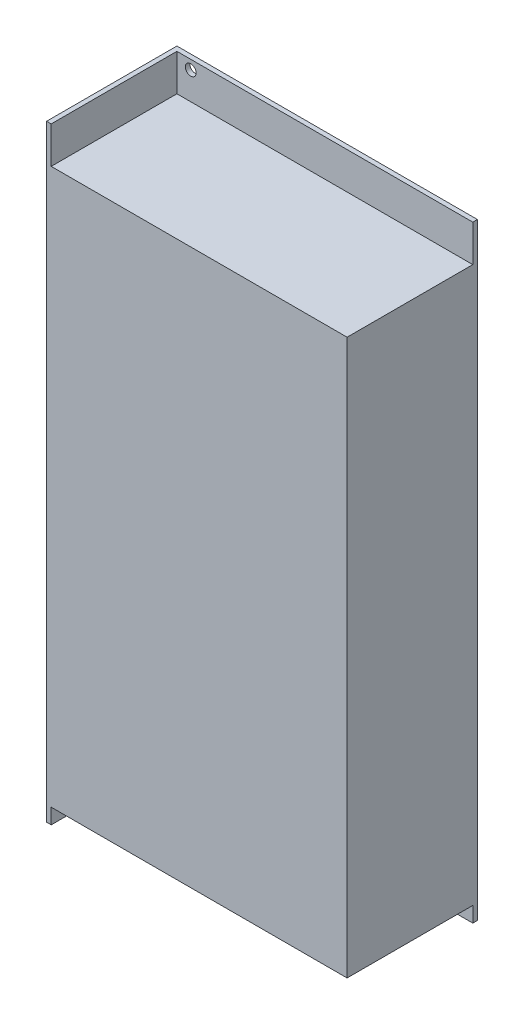
ISO-10303-21;
HEADER;
FILE_DESCRIPTION(('STEP AP214'),'2;1');
FILE_NAME('part.step','',(''),(''),'','','');
FILE_SCHEMA(('AUTOMOTIVE_DESIGN { 1 0 10303 214 1 1 1 1 }'));
ENDSEC;
DATA;
#1=APPLICATION_CONTEXT('core data for automotive mechanical design processes');
#2=APPLICATION_PROTOCOL_DEFINITION('international standard','automotive_design',2000,#1);
#3=PRODUCT_CONTEXT('',#1,'mechanical');
#4=PRODUCT('Part','Part','',(#3));
#5=PRODUCT_RELATED_PRODUCT_CATEGORY('part','',(#4));
#6=PRODUCT_DEFINITION_FORMATION('','',#4);
#7=PRODUCT_DEFINITION_CONTEXT('part definition',#1,'design');
#8=PRODUCT_DEFINITION('design','',#6,#7);
#9=PRODUCT_DEFINITION_SHAPE('','',#8);
#10=(LENGTH_UNIT() NAMED_UNIT(*) SI_UNIT(.MILLI.,.METRE.));
#11=(NAMED_UNIT(*) PLANE_ANGLE_UNIT() SI_UNIT($,.RADIAN.));
#12=(NAMED_UNIT(*) SI_UNIT($,.STERADIAN.) SOLID_ANGLE_UNIT());
#13=UNCERTAINTY_MEASURE_WITH_UNIT(LENGTH_MEASURE(1.E-05),#10,'distance_accuracy_value','');
#14=(GEOMETRIC_REPRESENTATION_CONTEXT(3) GLOBAL_UNCERTAINTY_ASSIGNED_CONTEXT((#13)) GLOBAL_UNIT_ASSIGNED_CONTEXT((#10,
#11,#12)) REPRESENTATION_CONTEXT('',''));
#15=CARTESIAN_POINT('',(0.,0.,0.));
#16=DIRECTION('',(0.,0.,1.));
#17=DIRECTION('',(1.,0.,0.));
#18=AXIS2_PLACEMENT_3D('',#15,#16,#17);
#19=CARTESIAN_POINT('',(0.,0.,1.5));
#20=DIRECTION('',(0.,0.,1.));
#21=DIRECTION('',(1.,0.,0.));
#22=AXIS2_PLACEMENT_3D('',#19,#20,#21);
#23=PLANE('',#22);
#24=CARTESIAN_POINT('',(-92.,-3.00000000000001,1.5));
#25=DIRECTION('',(0.,0.,1.));
#26=DIRECTION('',(1.,0.,0.));
#27=AXIS2_PLACEMENT_3D('',#24,#25,#26);
#28=CIRCLE('',#27,1.75);
#29=CARTESIAN_POINT('',(-90.25,-3.00000000000001,1.5));
#30=VERTEX_POINT('',#29);
#31=EDGE_CURVE('E205',#30,#30,#28,.T.);
#32=ORIENTED_EDGE('',*,*,#31,.F.);
#33=EDGE_LOOP('',(#32));
#34=FACE_BOUND('',#33,.T.);
#35=DIRECTION('',(0.,1.,0.));
#36=VECTOR('',#35,1.);
#37=CARTESIAN_POINT('',(-96.5,0.,1.5));
#38=LINE('',#37,#36);
#39=CARTESIAN_POINT('',(-96.5,-12.,1.5));
#40=VERTEX_POINT('',#39);
#41=CARTESIAN_POINT('',(-96.5,0.,1.5));
#42=VERTEX_POINT('',#41);
#43=EDGE_CURVE('E58',#40,#42,#38,.T.);
#44=ORIENTED_EDGE('',*,*,#43,.F.);
#45=DIRECTION('',(1.,0.,0.));
#46=VECTOR('',#45,1.);
#47=CARTESIAN_POINT('',(0.,-12.,1.5));
#48=LINE('',#47,#46);
#49=CARTESIAN_POINT('',(0.,-12.,1.5));
#50=VERTEX_POINT('',#49);
#51=EDGE_CURVE('E141',#40,#50,#48,.T.);
#52=ORIENTED_EDGE('',*,*,#51,.T.);
#53=DIRECTION('',(0.,-1.,0.));
#54=VECTOR('',#53,1.);
#55=CARTESIAN_POINT('',(0.,0.,1.5));
#56=LINE('',#55,#54);
#57=CARTESIAN_POINT('',(0.,0.,1.5));
#58=VERTEX_POINT('',#57);
#59=EDGE_CURVE('E198',#58,#50,#56,.T.);
#60=ORIENTED_EDGE('',*,*,#59,.F.);
#61=DIRECTION('',(-1.,0.,0.));
#62=VECTOR('',#61,1.);
#63=CARTESIAN_POINT('',(0.,0.,1.5));
#64=LINE('',#63,#62);
#65=EDGE_CURVE('E201',#58,#42,#64,.T.);
#66=ORIENTED_EDGE('',*,*,#65,.T.);
#67=EDGE_LOOP('',(#44,#52,#60,#66));
#68=FACE_BOUND('',#67,.T.);
#69=ADVANCED_FACE('F35',(#34,#68),#23,.T.);
#70=CARTESIAN_POINT('',(-6.74999999999998,-195.25,1.5));
#71=DIRECTION('',(0.,0.,-1.));
#72=DIRECTION('',(-1.,0.,0.));
#73=AXIS2_PLACEMENT_3D('',#70,#71,#72);
#74=CYLINDRICAL_SURFACE('',#73,1.75);
#75=CARTESIAN_POINT('',(-6.74999999999998,-195.25,0.));
#76=DIRECTION('',(0.,0.,1.));
#77=DIRECTION('',(1.,0.,0.));
#78=AXIS2_PLACEMENT_3D('',#75,#76,#77);
#79=CIRCLE('',#78,1.75);
#80=CARTESIAN_POINT('',(-4.99999999999998,-195.25,0.));
#81=VERTEX_POINT('',#80);
#82=CARTESIAN_POINT('',(-8.49999999999998,-195.25,0.));
#83=VERTEX_POINT('',#82);
#84=EDGE_CURVE('E143',#81,#83,#79,.T.);
#85=ORIENTED_EDGE('',*,*,#84,.F.);
#86=DIRECTION('',(0.,0.,-1.));
#87=VECTOR('',#86,1.);
#88=CARTESIAN_POINT('',(-4.99999999999998,-195.25,1.5));
#89=LINE('',#88,#87);
#90=CARTESIAN_POINT('',(-4.99999999999998,-195.25,1.5));
#91=VERTEX_POINT('',#90);
#92=EDGE_CURVE('E11',#91,#81,#89,.T.);
#93=ORIENTED_EDGE('',*,*,#92,.F.);
#94=CARTESIAN_POINT('',(-6.74999999999998,-195.25,1.5));
#95=DIRECTION('',(0.,0.,1.));
#96=DIRECTION('',(1.,0.,0.));
#97=AXIS2_PLACEMENT_3D('',#94,#95,#96);
#98=CIRCLE('',#97,1.75);
#99=CARTESIAN_POINT('',(-8.49999999999998,-195.25,1.5));
#100=VERTEX_POINT('',#99);
#101=EDGE_CURVE('E187',#91,#100,#98,.T.);
#102=ORIENTED_EDGE('',*,*,#101,.T.);
#103=DIRECTION('',(0.,0.,-1.));
#104=VECTOR('',#103,1.);
#105=CARTESIAN_POINT('',(-8.49999999999998,-195.25,1.5));
#106=LINE('',#105,#104);
#107=EDGE_CURVE('E208',#100,#83,#106,.T.);
#108=ORIENTED_EDGE('',*,*,#107,.T.);
#109=EDGE_LOOP('',(#85,#93,#102,#108));
#110=FACE_BOUND('',#109,.T.);
#111=ADVANCED_FACE('F37',(#110),#74,.F.);
#112=CARTESIAN_POINT('',(-4.99999999999998,0.,1.5));
#113=DIRECTION('',(1.,0.,0.));
#114=DIRECTION('',(0.,0.,-1.));
#115=AXIS2_PLACEMENT_3D('',#112,#113,#114);
#116=PLANE('',#115);
#117=DIRECTION('',(0.,-1.,0.));
#118=VECTOR('',#117,1.);
#119=CARTESIAN_POINT('',(-4.99999999999998,0.,0.));
#120=LINE('',#119,#118);
#121=CARTESIAN_POINT('',(-4.99999999999998,-198.,0.));
#122=VERTEX_POINT('',#121);
#123=EDGE_CURVE('E211',#81,#122,#120,.T.);
#124=ORIENTED_EDGE('',*,*,#123,.T.);
#125=DIRECTION('',(0.,0.,-1.));
#126=VECTOR('',#125,1.);
#127=CARTESIAN_POINT('',(-4.99999999999998,-198.,1.5));
#128=LINE('',#127,#126);
#129=CARTESIAN_POINT('',(-4.99999999999998,-198.,1.5));
#130=VERTEX_POINT('',#129);
#131=EDGE_CURVE('E43',#130,#122,#128,.T.);
#132=ORIENTED_EDGE('',*,*,#131,.F.);
#133=DIRECTION('',(0.,-1.,0.));
#134=VECTOR('',#133,1.);
#135=CARTESIAN_POINT('',(-4.99999999999998,0.,1.5));
#136=LINE('',#135,#134);
#137=EDGE_CURVE('E190',#91,#130,#136,.T.);
#138=ORIENTED_EDGE('',*,*,#137,.F.);
#139=ORIENTED_EDGE('',*,*,#92,.T.);
#140=EDGE_LOOP('',(#124,#132,#138,#139));
#141=FACE_BOUND('',#140,.T.);
#142=ADVANCED_FACE('F251',(#141),#116,.F.);
#143=CARTESIAN_POINT('',(0.,-198.,1.5));
#144=DIRECTION('',(0.,-1.,0.));
#145=DIRECTION('',(0.,0.,-1.));
#146=AXIS2_PLACEMENT_3D('',#143,#144,#145);
#147=PLANE('',#146);
#148=DIRECTION('',(-1.,0.,0.));
#149=VECTOR('',#148,1.);
#150=CARTESIAN_POINT('',(0.,-198.,0.));
#151=LINE('',#150,#149);
#152=CARTESIAN_POINT('',(0.,-198.,0.));
#153=VERTEX_POINT('',#152);
#154=EDGE_CURVE('E214',#153,#122,#151,.T.);
#155=ORIENTED_EDGE('',*,*,#154,.F.);
#156=DIRECTION('',(0.,0.,-1.));
#157=VECTOR('',#156,1.);
#158=CARTESIAN_POINT('',(0.,-198.,1.5));
#159=LINE('',#158,#157);
#160=CARTESIAN_POINT('',(0.,-198.,1.5));
#161=VERTEX_POINT('',#160);
#162=EDGE_CURVE('E241',#161,#153,#159,.T.);
#163=ORIENTED_EDGE('',*,*,#162,.F.);
#164=DIRECTION('',(-1.,0.,0.));
#165=VECTOR('',#164,1.);
#166=CARTESIAN_POINT('',(0.,-198.,1.5));
#167=LINE('',#166,#165);
#168=EDGE_CURVE('E193',#161,#130,#167,.T.);
#169=ORIENTED_EDGE('',*,*,#168,.T.);
#170=ORIENTED_EDGE('',*,*,#131,.T.);
#171=EDGE_LOOP('',(#155,#163,#169,#170));
#172=FACE_BOUND('',#171,.T.);
#173=ADVANCED_FACE('F245',(#172),#147,.T.);
#174=CARTESIAN_POINT('',(0.,0.,1.5));
#175=DIRECTION('',(1.,0.,0.));
#176=DIRECTION('',(0.,1.,0.));
#177=AXIS2_PLACEMENT_3D('',#174,#175,#176);
#178=PLANE('',#177);
#179=DIRECTION('',(0.,-1.,0.));
#180=VECTOR('',#179,1.);
#181=CARTESIAN_POINT('',(0.,0.,0.));
#182=LINE('',#181,#180);
#183=CARTESIAN_POINT('',(0.,0.,0.));
#184=VERTEX_POINT('',#183);
#185=EDGE_CURVE('E217',#184,#153,#182,.T.);
#186=ORIENTED_EDGE('',*,*,#185,.F.);
#187=DIRECTION('',(0.,0.,-1.));
#188=VECTOR('',#187,1.);
#189=CARTESIAN_POINT('',(0.,0.,1.5));
#190=LINE('',#189,#188);
#191=EDGE_CURVE('E239',#58,#184,#190,.T.);
#192=ORIENTED_EDGE('',*,*,#191,.F.);
#193=ORIENTED_EDGE('',*,*,#59,.T.);
#194=DIRECTION('',(0.,0.,-1.));
#195=VECTOR('',#194,1.);
#196=CARTESIAN_POINT('',(0.,-12.,42.5));
#197=LINE('',#196,#195);
#198=CARTESIAN_POINT('',(0.,-12.,42.5));
#199=VERTEX_POINT('',#198);
#200=EDGE_CURVE('E173',#199,#50,#197,.T.);
#201=ORIENTED_EDGE('',*,*,#200,.F.);
#202=DIRECTION('',(0.,1.,0.));
#203=VECTOR('',#202,1.);
#204=CARTESIAN_POINT('',(0.,0.,42.5));
#205=LINE('',#204,#203);
#206=CARTESIAN_POINT('',(0.,-193.,42.5));
#207=VERTEX_POINT('',#206);
#208=EDGE_CURVE('E158',#207,#199,#205,.T.);
#209=ORIENTED_EDGE('',*,*,#208,.F.);
#210=DIRECTION('',(0.,0.,-1.));
#211=VECTOR('',#210,1.);
#212=CARTESIAN_POINT('',(0.,-193.,42.5));
#213=LINE('',#212,#211);
#214=CARTESIAN_POINT('',(0.,-193.,1.5));
#215=VERTEX_POINT('',#214);
#216=EDGE_CURVE('E177',#207,#215,#213,.T.);
#217=ORIENTED_EDGE('',*,*,#216,.T.);
#218=EDGE_CURVE('E196',#215,#161,#56,.T.);
#219=ORIENTED_EDGE('',*,*,#218,.T.);
#220=ORIENTED_EDGE('',*,*,#162,.T.);
#221=EDGE_LOOP('',(#186,#192,#193,#201,#209,#217,#219,#220));
#222=FACE_BOUND('',#221,.T.);
#223=ADVANCED_FACE('F260',(#222),#178,.T.);
#224=CARTESIAN_POINT('',(0.,0.,1.5));
#225=DIRECTION('',(0.,-1.,0.));
#226=DIRECTION('',(1.,0.,0.));
#227=AXIS2_PLACEMENT_3D('',#224,#225,#226);
#228=PLANE('',#227);
#229=DIRECTION('',(-1.,0.,0.));
#230=VECTOR('',#229,1.);
#231=CARTESIAN_POINT('',(0.,0.,0.));
#232=LINE('',#231,#230);
#233=CARTESIAN_POINT('',(-98.,0.,0.));
#234=VERTEX_POINT('',#233);
#235=EDGE_CURVE('E221',#184,#234,#232,.T.);
#236=ORIENTED_EDGE('',*,*,#235,.T.);
#237=DIRECTION('',(0.,0.,-1.));
#238=VECTOR('',#237,1.);
#239=CARTESIAN_POINT('',(-98.,0.,1.5));
#240=LINE('',#239,#238);
#241=CARTESIAN_POINT('',(-98.,0.,42.5));
#242=VERTEX_POINT('',#241);
#243=EDGE_CURVE('E236',#242,#234,#240,.T.);
#244=ORIENTED_EDGE('',*,*,#243,.F.);
#245=DIRECTION('',(-1.,0.,0.));
#246=VECTOR('',#245,1.);
#247=CARTESIAN_POINT('',(0.,0.,42.5));
#248=LINE('',#247,#246);
#249=CARTESIAN_POINT('',(-96.5,0.,42.5));
#250=VERTEX_POINT('',#249);
#251=EDGE_CURVE('E153',#250,#242,#248,.T.);
#252=ORIENTED_EDGE('',*,*,#251,.F.);
#253=DIRECTION('',(0.,0.,-1.));
#254=VECTOR('',#253,1.);
#255=CARTESIAN_POINT('',(-96.5,0.,42.5));
#256=LINE('',#255,#254);
#257=EDGE_CURVE('E144',#250,#42,#256,.T.);
#258=ORIENTED_EDGE('',*,*,#257,.T.);
#259=ORIENTED_EDGE('',*,*,#65,.F.);
#260=ORIENTED_EDGE('',*,*,#191,.T.);
#261=EDGE_LOOP('',(#236,#244,#252,#258,#259,#260));
#262=FACE_BOUND('',#261,.T.);
#263=ADVANCED_FACE('F281',(#262),#228,.F.);
#264=CARTESIAN_POINT('',(-98.,0.,1.5));
#265=DIRECTION('',(1.,0.,0.));
#266=DIRECTION('',(0.,0.,-1.));
#267=AXIS2_PLACEMENT_3D('',#264,#265,#266);
#268=PLANE('',#267);
#269=DIRECTION('',(0.,-1.,0.));
#270=VECTOR('',#269,1.);
#271=CARTESIAN_POINT('',(-98.,0.,0.));
#272=LINE('',#271,#270);
#273=CARTESIAN_POINT('',(-98.,-198.,0.));
#274=VERTEX_POINT('',#273);
#275=EDGE_CURVE('E223',#234,#274,#272,.T.);
#276=ORIENTED_EDGE('',*,*,#275,.T.);
#277=DIRECTION('',(0.,0.,-1.));
#278=VECTOR('',#277,1.);
#279=CARTESIAN_POINT('',(-98.,-198.,1.5));
#280=LINE('',#279,#278);
#281=CARTESIAN_POINT('',(-98.,-198.,42.5));
#282=VERTEX_POINT('',#281);
#283=EDGE_CURVE('E234',#282,#274,#280,.T.);
#284=ORIENTED_EDGE('',*,*,#283,.F.);
#285=DIRECTION('',(0.,-1.,0.));
#286=VECTOR('',#285,1.);
#287=CARTESIAN_POINT('',(-98.,0.,42.5));
#288=LINE('',#287,#286);
#289=EDGE_CURVE('E165',#242,#282,#288,.T.);
#290=ORIENTED_EDGE('',*,*,#289,.F.);
#291=ORIENTED_EDGE('',*,*,#243,.T.);
#292=EDGE_LOOP('',(#276,#284,#290,#291));
#293=FACE_BOUND('',#292,.T.);
#294=ADVANCED_FACE('F279',(#293),#268,.F.);
#295=CARTESIAN_POINT('',(-8.49999999999998,-198.,0.));
#296=VERTEX_POINT('',#295);
#297=EDGE_CURVE('E218',#296,#274,#151,.T.);
#298=ORIENTED_EDGE('',*,*,#297,.F.);
#299=DIRECTION('',(0.,0.,-1.));
#300=VECTOR('',#299,1.);
#301=CARTESIAN_POINT('',(-8.49999999999998,-198.,1.5));
#302=LINE('',#301,#300);
#303=CARTESIAN_POINT('',(-8.49999999999998,-198.,1.5));
#304=VERTEX_POINT('',#303);
#305=EDGE_CURVE('E232',#304,#296,#302,.T.);
#306=ORIENTED_EDGE('',*,*,#305,.F.);
#307=CARTESIAN_POINT('',(-96.5,-198.,1.5));
#308=VERTEX_POINT('',#307);
#309=EDGE_CURVE('E197',#304,#308,#167,.T.);
#310=ORIENTED_EDGE('',*,*,#309,.T.);
#311=DIRECTION('',(0.,0.,-1.));
#312=VECTOR('',#311,1.);
#313=CARTESIAN_POINT('',(-96.5,-198.,42.5));
#314=LINE('',#313,#312);
#315=CARTESIAN_POINT('',(-96.5,-198.,42.5));
#316=VERTEX_POINT('',#315);
#317=EDGE_CURVE('E183',#316,#308,#314,.T.);
#318=ORIENTED_EDGE('',*,*,#317,.F.);
#319=DIRECTION('',(1.,0.,0.));
#320=VECTOR('',#319,1.);
#321=CARTESIAN_POINT('',(0.,-198.,42.5));
#322=LINE('',#321,#320);
#323=EDGE_CURVE('E168',#282,#316,#322,.T.);
#324=ORIENTED_EDGE('',*,*,#323,.F.);
#325=ORIENTED_EDGE('',*,*,#283,.T.);
#326=EDGE_LOOP('',(#298,#306,#310,#318,#324,#325));
#327=FACE_BOUND('',#326,.T.);
#328=ADVANCED_FACE('F273',(#327),#147,.T.);
#329=CARTESIAN_POINT('',(-8.49999999999998,0.,1.5));
#330=DIRECTION('',(-1.,0.,0.));
#331=DIRECTION('',(0.,0.,1.));
#332=AXIS2_PLACEMENT_3D('',#329,#330,#331);
#333=PLANE('',#332);
#334=DIRECTION('',(0.,1.,0.));
#335=VECTOR('',#334,1.);
#336=CARTESIAN_POINT('',(-8.49999999999998,0.,0.));
#337=LINE('',#336,#335);
#338=EDGE_CURVE('E226',#296,#83,#337,.T.);
#339=ORIENTED_EDGE('',*,*,#338,.T.);
#340=ORIENTED_EDGE('',*,*,#107,.F.);
#341=DIRECTION('',(0.,1.,0.));
#342=VECTOR('',#341,1.);
#343=CARTESIAN_POINT('',(-8.49999999999998,0.,1.5));
#344=LINE('',#343,#342);
#345=EDGE_CURVE('E203',#304,#100,#344,.T.);
#346=ORIENTED_EDGE('',*,*,#345,.F.);
#347=ORIENTED_EDGE('',*,*,#305,.T.);
#348=EDGE_LOOP('',(#339,#340,#346,#347));
#349=FACE_BOUND('',#348,.T.);
#350=ADVANCED_FACE('F306',(#349),#333,.F.);
#351=CARTESIAN_POINT('',(-92.,-3.00000000000001,1.5));
#352=DIRECTION('',(0.,0.,-1.));
#353=DIRECTION('',(-1.,0.,0.));
#354=AXIS2_PLACEMENT_3D('',#351,#352,#353);
#355=CYLINDRICAL_SURFACE('',#354,1.75);
#356=ORIENTED_EDGE('',*,*,#31,.T.);
#357=EDGE_LOOP('',(#356));
#358=FACE_BOUND('',#357,.T.);
#359=CARTESIAN_POINT('',(-92.,-3.00000000000001,0.));
#360=DIRECTION('',(0.,0.,1.));
#361=DIRECTION('',(1.,0.,0.));
#362=AXIS2_PLACEMENT_3D('',#359,#360,#361);
#363=CIRCLE('',#362,1.75);
#364=CARTESIAN_POINT('',(-90.25,-3.00000000000001,0.));
#365=VERTEX_POINT('',#364);
#366=EDGE_CURVE('E191',#365,#365,#363,.T.);
#367=ORIENTED_EDGE('',*,*,#366,.F.);
#368=EDGE_LOOP('',(#367));
#369=FACE_BOUND('',#368,.T.);
#370=ADVANCED_FACE('F301',(#358,#369),#355,.F.);
#371=DIRECTION('',(1.,0.,0.));
#372=VECTOR('',#371,1.);
#373=CARTESIAN_POINT('',(0.,-193.,1.5));
#374=LINE('',#373,#372);
#375=CARTESIAN_POINT('',(-96.5,-193.,1.5));
#376=VERTEX_POINT('',#375);
#377=EDGE_CURVE('E50',#376,#215,#374,.T.);
#378=ORIENTED_EDGE('',*,*,#377,.F.);
#379=EDGE_CURVE('E161',#308,#376,#38,.T.);
#380=ORIENTED_EDGE('',*,*,#379,.F.);
#381=ORIENTED_EDGE('',*,*,#309,.F.);
#382=ORIENTED_EDGE('',*,*,#345,.T.);
#383=ORIENTED_EDGE('',*,*,#101,.F.);
#384=ORIENTED_EDGE('',*,*,#137,.T.);
#385=ORIENTED_EDGE('',*,*,#168,.F.);
#386=ORIENTED_EDGE('',*,*,#218,.F.);
#387=EDGE_LOOP('',(#378,#380,#381,#382,#383,#384,#385,#386));
#388=FACE_BOUND('',#387,.T.);
#389=ADVANCED_FACE('F262',(#388),#23,.T.);
#390=CARTESIAN_POINT('',(0.,0.,0.));
#391=DIRECTION('',(0.,0.,1.));
#392=DIRECTION('',(1.,0.,0.));
#393=AXIS2_PLACEMENT_3D('',#390,#391,#392);
#394=PLANE('',#393);
#395=ORIENTED_EDGE('',*,*,#84,.T.);
#396=ORIENTED_EDGE('',*,*,#338,.F.);
#397=ORIENTED_EDGE('',*,*,#297,.T.);
#398=ORIENTED_EDGE('',*,*,#275,.F.);
#399=ORIENTED_EDGE('',*,*,#235,.F.);
#400=ORIENTED_EDGE('',*,*,#185,.T.);
#401=ORIENTED_EDGE('',*,*,#154,.T.);
#402=ORIENTED_EDGE('',*,*,#123,.F.);
#403=EDGE_LOOP('',(#395,#396,#397,#398,#399,#400,#401,#402));
#404=FACE_BOUND('',#403,.T.);
#405=ORIENTED_EDGE('',*,*,#366,.T.);
#406=EDGE_LOOP('',(#405));
#407=FACE_BOUND('',#406,.T.);
#408=ADVANCED_FACE('F254',(#404,#407),#394,.F.);
#409=CARTESIAN_POINT('',(0.,-12.,42.5));
#410=DIRECTION('',(0.,1.,0.));
#411=DIRECTION('',(0.,0.,1.));
#412=AXIS2_PLACEMENT_3D('',#409,#410,#411);
#413=PLANE('',#412);
#414=ORIENTED_EDGE('',*,*,#51,.F.);
#415=DIRECTION('',(0.,0.,-1.));
#416=VECTOR('',#415,1.);
#417=CARTESIAN_POINT('',(-96.5,-12.,42.5));
#418=LINE('',#417,#416);
#419=CARTESIAN_POINT('',(-96.5,-12.,42.5));
#420=VERTEX_POINT('',#419);
#421=EDGE_CURVE('E135',#420,#40,#418,.T.);
#422=ORIENTED_EDGE('',*,*,#421,.F.);
#423=DIRECTION('',(1.,0.,0.));
#424=VECTOR('',#423,1.);
#425=CARTESIAN_POINT('',(0.,-12.,42.5));
#426=LINE('',#425,#424);
#427=EDGE_CURVE('E140',#420,#199,#426,.T.);
#428=ORIENTED_EDGE('',*,*,#427,.T.);
#429=ORIENTED_EDGE('',*,*,#200,.T.);
#430=EDGE_LOOP('',(#414,#422,#428,#429));
#431=FACE_BOUND('',#430,.T.);
#432=ADVANCED_FACE('F137',(#431),#413,.T.);
#433=CARTESIAN_POINT('',(-96.5,0.,42.5));
#434=DIRECTION('',(-1.,0.,0.));
#435=DIRECTION('',(0.,0.,1.));
#436=AXIS2_PLACEMENT_3D('',#433,#434,#435);
#437=PLANE('',#436);
#438=ORIENTED_EDGE('',*,*,#43,.T.);
#439=ORIENTED_EDGE('',*,*,#257,.F.);
#440=DIRECTION('',(0.,1.,0.));
#441=VECTOR('',#440,1.);
#442=CARTESIAN_POINT('',(-96.5,0.,42.5));
#443=LINE('',#442,#441);
#444=EDGE_CURVE('E147',#420,#250,#443,.T.);
#445=ORIENTED_EDGE('',*,*,#444,.F.);
#446=ORIENTED_EDGE('',*,*,#421,.T.);
#447=EDGE_LOOP('',(#438,#439,#445,#446));
#448=FACE_BOUND('',#447,.T.);
#449=ADVANCED_FACE('F148',(#448),#437,.F.);
#450=ORIENTED_EDGE('',*,*,#379,.T.);
#451=DIRECTION('',(0.,0.,-1.));
#452=VECTOR('',#451,1.);
#453=CARTESIAN_POINT('',(-96.5,-193.,42.5));
#454=LINE('',#453,#452);
#455=CARTESIAN_POINT('',(-96.5,-193.,42.5));
#456=VERTEX_POINT('',#455);
#457=EDGE_CURVE('E180',#456,#376,#454,.T.);
#458=ORIENTED_EDGE('',*,*,#457,.F.);
#459=EDGE_CURVE('E155',#316,#456,#443,.T.);
#460=ORIENTED_EDGE('',*,*,#459,.F.);
#461=ORIENTED_EDGE('',*,*,#317,.T.);
#462=EDGE_LOOP('',(#450,#458,#460,#461));
#463=FACE_BOUND('',#462,.T.);
#464=ADVANCED_FACE('F285',(#463),#437,.F.);
#465=CARTESIAN_POINT('',(0.,-193.,42.5));
#466=DIRECTION('',(0.,1.,0.));
#467=DIRECTION('',(0.,0.,1.));
#468=AXIS2_PLACEMENT_3D('',#465,#466,#467);
#469=PLANE('',#468);
#470=ORIENTED_EDGE('',*,*,#377,.T.);
#471=ORIENTED_EDGE('',*,*,#216,.F.);
#472=DIRECTION('',(1.,0.,0.));
#473=VECTOR('',#472,1.);
#474=CARTESIAN_POINT('',(0.,-193.,42.5));
#475=LINE('',#474,#473);
#476=EDGE_CURVE('E170',#456,#207,#475,.T.);
#477=ORIENTED_EDGE('',*,*,#476,.F.);
#478=ORIENTED_EDGE('',*,*,#457,.T.);
#479=EDGE_LOOP('',(#470,#471,#477,#478));
#480=FACE_BOUND('',#479,.T.);
#481=ADVANCED_FACE('F289',(#480),#469,.F.);
#482=CARTESIAN_POINT('',(0.,0.,42.5));
#483=DIRECTION('',(0.,0.,1.));
#484=DIRECTION('',(1.,0.,0.));
#485=AXIS2_PLACEMENT_3D('',#482,#483,#484);
#486=PLANE('',#485);
#487=ORIENTED_EDGE('',*,*,#427,.F.);
#488=ORIENTED_EDGE('',*,*,#444,.T.);
#489=ORIENTED_EDGE('',*,*,#251,.T.);
#490=ORIENTED_EDGE('',*,*,#289,.T.);
#491=ORIENTED_EDGE('',*,*,#323,.T.);
#492=ORIENTED_EDGE('',*,*,#459,.T.);
#493=ORIENTED_EDGE('',*,*,#476,.T.);
#494=ORIENTED_EDGE('',*,*,#208,.T.);
#495=EDGE_LOOP('',(#487,#488,#489,#490,#491,#492,#493,#494));
#496=FACE_BOUND('',#495,.T.);
#497=ADVANCED_FACE('F156',(#496),#486,.T.);
#498=CLOSED_SHELL('',(#69,#111,#142,#173,#223,#263,#294,#328,#350,#370,#389,#408,#432,#449,#464,
#481,#497));
#499=MANIFOLD_SOLID_BREP('B2',#498);
#500=ADVANCED_BREP_SHAPE_REPRESENTATION('',(#18,#499),#14);
#501=SHAPE_DEFINITION_REPRESENTATION(#9,#500);
ENDSEC;
END-ISO-10303-21;
